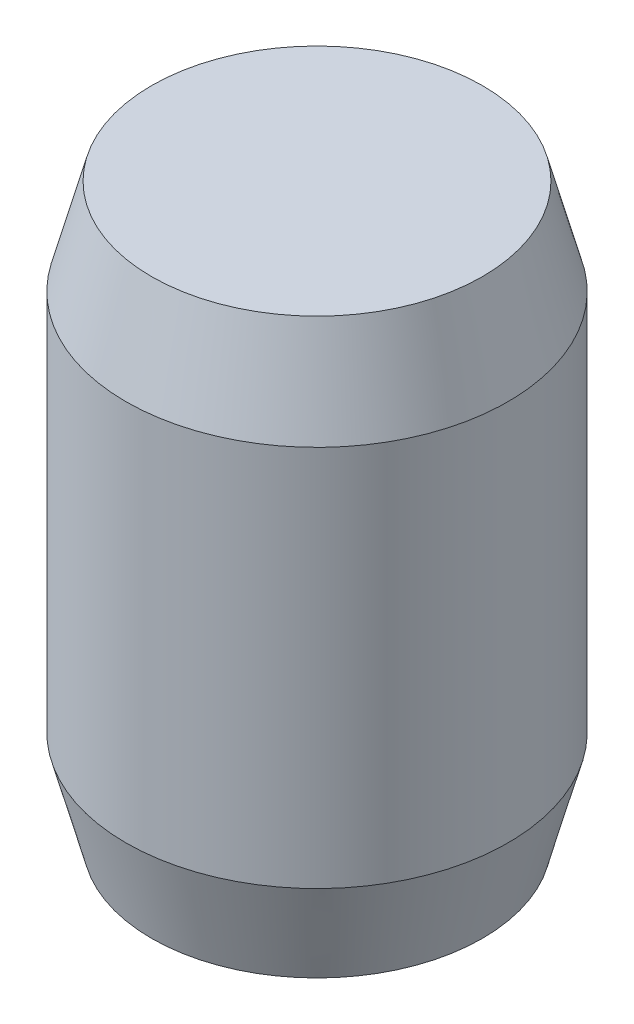
ISO-10303-21;
HEADER;
FILE_DESCRIPTION(('STEP AP214'),'2;1');
FILE_NAME('part.step','',(''),(''),'','','');
FILE_SCHEMA(('AUTOMOTIVE_DESIGN { 1 0 10303 214 1 1 1 1 }'));
ENDSEC;
DATA;
#1=APPLICATION_CONTEXT('core data for automotive mechanical design processes');
#2=APPLICATION_PROTOCOL_DEFINITION('international standard','automotive_design',2000,#1);
#3=PRODUCT_CONTEXT('',#1,'mechanical');
#4=PRODUCT('Part','Part','',(#3));
#5=PRODUCT_RELATED_PRODUCT_CATEGORY('part','',(#4));
#6=PRODUCT_DEFINITION_FORMATION('','',#4);
#7=PRODUCT_DEFINITION_CONTEXT('part definition',#1,'design');
#8=PRODUCT_DEFINITION('design','',#6,#7);
#9=PRODUCT_DEFINITION_SHAPE('','',#8);
#10=(LENGTH_UNIT() NAMED_UNIT(*) SI_UNIT(.MILLI.,.METRE.));
#11=(NAMED_UNIT(*) PLANE_ANGLE_UNIT() SI_UNIT($,.RADIAN.));
#12=(NAMED_UNIT(*) SI_UNIT($,.STERADIAN.) SOLID_ANGLE_UNIT());
#13=UNCERTAINTY_MEASURE_WITH_UNIT(LENGTH_MEASURE(1.E-05),#10,'distance_accuracy_value','');
#14=(GEOMETRIC_REPRESENTATION_CONTEXT(3) GLOBAL_UNCERTAINTY_ASSIGNED_CONTEXT((#13)) GLOBAL_UNIT_ASSIGNED_CONTEXT((#10,
#11,#12)) REPRESENTATION_CONTEXT('',''));
#15=CARTESIAN_POINT('',(0.,0.,0.));
#16=DIRECTION('',(0.,0.,1.));
#17=DIRECTION('',(1.,0.,0.));
#18=AXIS2_PLACEMENT_3D('',#15,#16,#17);
#19=CARTESIAN_POINT('',(0.,6.,0.));
#20=DIRECTION('',(0.,1.,0.));
#21=DIRECTION('',(0.,0.,1.));
#22=AXIS2_PLACEMENT_3D('',#19,#20,#21);
#23=PLANE('',#22);
#24=CARTESIAN_POINT('',(0.,6.,0.));
#25=DIRECTION('',(0.,-1.,0.));
#26=DIRECTION('',(0.,0.,-1.));
#27=AXIS2_PLACEMENT_3D('',#24,#25,#26);
#28=CIRCLE('',#27,1.73205080756888);
#29=CARTESIAN_POINT('',(0.,6.,-1.73205080756888));
#30=VERTEX_POINT('',#29);
#31=EDGE_CURVE('E10',#30,#30,#28,.T.);
#32=ORIENTED_EDGE('',*,*,#31,.F.);
#33=EDGE_LOOP('',(#32));
#34=FACE_BOUND('',#33,.T.);
#35=ADVANCED_FACE('F39',(#34),#23,.T.);
#36=CARTESIAN_POINT('',(0.,5.,0.));
#37=DIRECTION('',(0.,-1.,0.));
#38=DIRECTION('',(0.,0.,-1.));
#39=AXIS2_PLACEMENT_3D('',#36,#37,#38);
#40=CONICAL_SURFACE('',#39,2.,0.261799387799143);
#41=ORIENTED_EDGE('',*,*,#31,.T.);
#42=EDGE_LOOP('',(#41));
#43=FACE_BOUND('',#42,.T.);
#44=CARTESIAN_POINT('',(0.,5.,0.));
#45=DIRECTION('',(0.,-1.,0.));
#46=DIRECTION('',(0.,0.,-1.));
#47=AXIS2_PLACEMENT_3D('',#44,#45,#46);
#48=CIRCLE('',#47,2.);
#49=CARTESIAN_POINT('',(0.,5.,-2.));
#50=VERTEX_POINT('',#49);
#51=EDGE_CURVE('E44',#50,#50,#48,.T.);
#52=ORIENTED_EDGE('',*,*,#51,.F.);
#53=EDGE_LOOP('',(#52));
#54=FACE_BOUND('',#53,.T.);
#55=ADVANCED_FACE('F72',(#43,#54),#40,.T.);
#56=CARTESIAN_POINT('',(0.,0.,0.));
#57=DIRECTION('',(0.,-1.,0.));
#58=DIRECTION('',(0.,0.,-1.));
#59=AXIS2_PLACEMENT_3D('',#56,#57,#58);
#60=CYLINDRICAL_SURFACE('',#59,2.);
#61=ORIENTED_EDGE('',*,*,#51,.T.);
#62=EDGE_LOOP('',(#61));
#63=FACE_BOUND('',#62,.T.);
#64=CARTESIAN_POINT('',(0.,1.,0.));
#65=DIRECTION('',(0.,-1.,0.));
#66=DIRECTION('',(0.,0.,-1.));
#67=AXIS2_PLACEMENT_3D('',#64,#65,#66);
#68=CIRCLE('',#67,2.);
#69=CARTESIAN_POINT('',(0.,1.,-2.));
#70=VERTEX_POINT('',#69);
#71=EDGE_CURVE('E47',#70,#70,#68,.T.);
#72=ORIENTED_EDGE('',*,*,#71,.F.);
#73=EDGE_LOOP('',(#72));
#74=FACE_BOUND('',#73,.T.);
#75=ADVANCED_FACE('F62',(#63,#74),#60,.T.);
#76=CARTESIAN_POINT('',(0.,0.,0.));
#77=DIRECTION('',(0.,1.,0.));
#78=DIRECTION('',(0.,0.,1.));
#79=AXIS2_PLACEMENT_3D('',#76,#77,#78);
#80=CONICAL_SURFACE('',#79,1.73205080756889,0.261799387799139);
#81=ORIENTED_EDGE('',*,*,#71,.T.);
#82=EDGE_LOOP('',(#81));
#83=FACE_BOUND('',#82,.T.);
#84=CARTESIAN_POINT('',(0.,0.,0.));
#85=DIRECTION('',(0.,-1.,0.));
#86=DIRECTION('',(0.,0.,-1.));
#87=AXIS2_PLACEMENT_3D('',#84,#85,#86);
#88=CIRCLE('',#87,1.73205080756889);
#89=CARTESIAN_POINT('',(0.,0.,-1.73205080756889));
#90=VERTEX_POINT('',#89);
#91=EDGE_CURVE('E52',#90,#90,#88,.T.);
#92=ORIENTED_EDGE('',*,*,#91,.F.);
#93=EDGE_LOOP('',(#92));
#94=FACE_BOUND('',#93,.T.);
#95=ADVANCED_FACE('F63',(#83,#94),#80,.T.);
#96=CARTESIAN_POINT('',(0.,0.,0.));
#97=DIRECTION('',(0.,-1.,0.));
#98=DIRECTION('',(0.,0.,-1.));
#99=AXIS2_PLACEMENT_3D('',#96,#97,#98);
#100=PLANE('',#99);
#101=ORIENTED_EDGE('',*,*,#91,.T.);
#102=EDGE_LOOP('',(#101));
#103=FACE_BOUND('',#102,.T.);
#104=ADVANCED_FACE('F56',(#103),#100,.T.);
#105=CLOSED_SHELL('',(#35,#55,#75,#95,#104));
#106=MANIFOLD_SOLID_BREP('B2',#105);
#107=ADVANCED_BREP_SHAPE_REPRESENTATION('',(#18,#106),#14);
#108=SHAPE_DEFINITION_REPRESENTATION(#9,#107);
ENDSEC;
END-ISO-10303-21;
